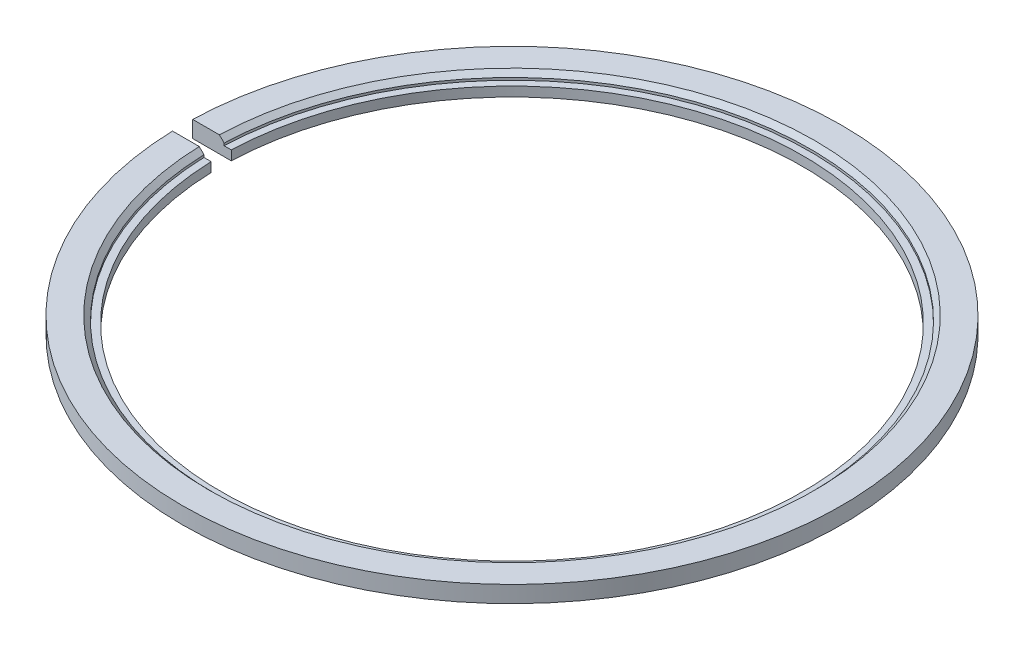
ISO-10303-21;
HEADER;
FILE_DESCRIPTION(('STEP AP214'),'2;1');
FILE_NAME('part.step','',(''),(''),'','','');
FILE_SCHEMA(('AUTOMOTIVE_DESIGN { 1 0 10303 214 1 1 1 1 }'));
ENDSEC;
DATA;
#1=APPLICATION_CONTEXT('core data for automotive mechanical design processes');
#2=APPLICATION_PROTOCOL_DEFINITION('international standard','automotive_design',2000,#1);
#3=PRODUCT_CONTEXT('',#1,'mechanical');
#4=PRODUCT('Part','Part','',(#3));
#5=PRODUCT_RELATED_PRODUCT_CATEGORY('part','',(#4));
#6=PRODUCT_DEFINITION_FORMATION('','',#4);
#7=PRODUCT_DEFINITION_CONTEXT('part definition',#1,'design');
#8=PRODUCT_DEFINITION('design','',#6,#7);
#9=PRODUCT_DEFINITION_SHAPE('','',#8);
#10=(LENGTH_UNIT() NAMED_UNIT(*) SI_UNIT(.MILLI.,.METRE.));
#11=(NAMED_UNIT(*) PLANE_ANGLE_UNIT() SI_UNIT($,.RADIAN.));
#12=(NAMED_UNIT(*) SI_UNIT($,.STERADIAN.) SOLID_ANGLE_UNIT());
#13=UNCERTAINTY_MEASURE_WITH_UNIT(LENGTH_MEASURE(1.E-05),#10,'distance_accuracy_value','');
#14=(GEOMETRIC_REPRESENTATION_CONTEXT(3) GLOBAL_UNCERTAINTY_ASSIGNED_CONTEXT((#13)) GLOBAL_UNIT_ASSIGNED_CONTEXT((#10,
#11,#12)) REPRESENTATION_CONTEXT('',''));
#15=CARTESIAN_POINT('',(0.,0.,0.));
#16=DIRECTION('',(0.,0.,1.));
#17=DIRECTION('',(1.,0.,0.));
#18=AXIS2_PLACEMENT_3D('',#15,#16,#17);
#19=CARTESIAN_POINT('',(-31.115,0.,0.));
#20=DIRECTION('',(0.,-1.,0.));
#21=DIRECTION('',(1.,0.,0.));
#22=AXIS2_PLACEMENT_3D('',#19,#20,#21);
#23=CYLINDRICAL_SURFACE('',#22,31.115);
#24=DIRECTION('',(0.,-1.,0.));
#25=VECTOR('',#24,1.);
#26=CARTESIAN_POINT('',(-62.2112683412335,0.,1.0795));
#27=LINE('',#26,#25);
#28=CARTESIAN_POINT('',(-62.2112683412335,1.01600000000004,1.0795));
#29=VERTEX_POINT('',#28);
#30=CARTESIAN_POINT('',(-62.2112683412335,0.,1.0795));
#31=VERTEX_POINT('',#30);
#32=EDGE_CURVE('E170',#29,#31,#27,.T.);
#33=ORIENTED_EDGE('',*,*,#32,.F.);
#34=CARTESIAN_POINT('',(-31.115,1.01600000000002,0.));
#35=DIRECTION('',(0.,-1.,0.));
#36=DIRECTION('',(1.,0.,0.));
#37=AXIS2_PLACEMENT_3D('',#34,#35,#36);
#38=CIRCLE('',#37,31.115);
#39=CARTESIAN_POINT('',(-62.2112683412335,1.01600000000004,-1.0795));
#40=VERTEX_POINT('',#39);
#41=EDGE_CURVE('E131',#40,#29,#38,.T.);
#42=ORIENTED_EDGE('',*,*,#41,.F.);
#43=DIRECTION('',(0.,-1.,0.));
#44=VECTOR('',#43,1.);
#45=CARTESIAN_POINT('',(-62.2112683412335,0.,-1.0795));
#46=LINE('',#45,#44);
#47=CARTESIAN_POINT('',(-62.2112683412335,0.,-1.0795));
#48=VERTEX_POINT('',#47);
#49=EDGE_CURVE('E107',#40,#48,#46,.T.);
#50=ORIENTED_EDGE('',*,*,#49,.T.);
#51=CARTESIAN_POINT('',(-31.115,0.,0.));
#52=DIRECTION('',(0.,-1.,0.));
#53=DIRECTION('',(1.,0.,0.));
#54=AXIS2_PLACEMENT_3D('',#51,#52,#53);
#55=CIRCLE('',#54,31.115);
#56=EDGE_CURVE('E116',#48,#31,#55,.T.);
#57=ORIENTED_EDGE('',*,*,#56,.T.);
#58=EDGE_LOOP('',(#33,#42,#50,#57));
#59=FACE_BOUND('',#58,.T.);
#60=ADVANCED_FACE('F35',(#59),#23,.F.);
#61=CARTESIAN_POINT('',(0.,1.016,0.));
#62=DIRECTION('',(0.,1.,0.));
#63=DIRECTION('',(-1.,0.,0.));
#64=AXIS2_PLACEMENT_3D('',#61,#62,#63);
#65=PLANE('',#64);
#66=DIRECTION('',(1.,0.,0.));
#67=VECTOR('',#66,1.);
#68=CARTESIAN_POINT('',(0.,1.016,1.0795));
#69=LINE('',#68,#67);
#70=CARTESIAN_POINT('',(-62.9737163700925,1.016,1.0795));
#71=VERTEX_POINT('',#70);
#72=EDGE_CURVE('E171',#71,#29,#69,.T.);
#73=ORIENTED_EDGE('',*,*,#72,.F.);
#74=CARTESIAN_POINT('',(-31.115,1.01600000000002,0.));
#75=DIRECTION('',(0.,-1.,0.));
#76=DIRECTION('',(1.,0.,0.));
#77=AXIS2_PLACEMENT_3D('',#74,#75,#76);
#78=CIRCLE('',#77,31.877);
#79=CARTESIAN_POINT('',(-62.9737163700925,1.016,-1.0795));
#80=VERTEX_POINT('',#79);
#81=EDGE_CURVE('E124',#80,#71,#78,.T.);
#82=ORIENTED_EDGE('',*,*,#81,.F.);
#83=DIRECTION('',(1.,0.,0.));
#84=VECTOR('',#83,1.);
#85=CARTESIAN_POINT('',(0.,1.016,-1.0795));
#86=LINE('',#85,#84);
#87=EDGE_CURVE('E176',#80,#40,#86,.T.);
#88=ORIENTED_EDGE('',*,*,#87,.T.);
#89=ORIENTED_EDGE('',*,*,#41,.T.);
#90=EDGE_LOOP('',(#73,#82,#88,#89));
#91=FACE_BOUND('',#90,.T.);
#92=ADVANCED_FACE('F160',(#91),#65,.T.);
#93=CARTESIAN_POINT('',(-31.115,0.,0.));
#94=DIRECTION('',(0.,-1.,0.));
#95=DIRECTION('',(1.,0.,0.));
#96=AXIS2_PLACEMENT_3D('',#93,#94,#95);
#97=CYLINDRICAL_SURFACE('',#96,31.877);
#98=DIRECTION('',(0.,-1.,0.));
#99=VECTOR('',#98,1.);
#100=CARTESIAN_POINT('',(-62.9737163700925,0.,1.0795));
#101=LINE('',#100,#99);
#102=CARTESIAN_POINT('',(-62.9737163700925,1.27000000000004,1.0795));
#103=VERTEX_POINT('',#102);
#104=EDGE_CURVE('E183',#103,#71,#101,.T.);
#105=ORIENTED_EDGE('',*,*,#104,.F.);
#106=CARTESIAN_POINT('',(-31.115,1.27000000000004,0.));
#107=DIRECTION('',(0.,1.,0.));
#108=DIRECTION('',(0.,0.,1.));
#109=AXIS2_PLACEMENT_3D('',#106,#107,#108);
#110=CIRCLE('',#109,31.877);
#111=CARTESIAN_POINT('',(-62.9737163700925,1.27000000000004,-1.0795));
#112=VERTEX_POINT('',#111);
#113=EDGE_CURVE('E137',#103,#112,#110,.T.);
#114=ORIENTED_EDGE('',*,*,#113,.T.);
#115=DIRECTION('',(0.,-1.,0.));
#116=VECTOR('',#115,1.);
#117=CARTESIAN_POINT('',(-62.9737163700925,0.,-1.0795));
#118=LINE('',#117,#116);
#119=EDGE_CURVE('E62',#112,#80,#118,.T.);
#120=ORIENTED_EDGE('',*,*,#119,.T.);
#121=ORIENTED_EDGE('',*,*,#81,.T.);
#122=EDGE_LOOP('',(#105,#114,#120,#121));
#123=FACE_BOUND('',#122,.T.);
#124=ADVANCED_FACE('F156',(#123),#97,.F.);
#125=CARTESIAN_POINT('',(0.762,1.778,0.));
#126=DIRECTION('',(0.,1.,0.));
#127=DIRECTION('',(-1.,0.,0.));
#128=AXIS2_PLACEMENT_3D('',#125,#126,#127);
#129=PLANE('',#128);
#130=DIRECTION('',(1.,0.,0.));
#131=VECTOR('',#130,1.);
#132=CARTESIAN_POINT('',(0.762,1.778,1.0795));
#133=LINE('',#132,#131);
#134=CARTESIAN_POINT('',(-66.3409632373623,1.77800000000005,1.0795));
#135=VERTEX_POINT('',#134);
#136=CARTESIAN_POINT('',(-63.4820033328697,1.77800000000004,1.0795));
#137=VERTEX_POINT('',#136);
#138=EDGE_CURVE('E54',#135,#137,#133,.T.);
#139=ORIENTED_EDGE('',*,*,#138,.F.);
#140=CARTESIAN_POINT('',(-31.115,1.77800000000002,0.));
#141=DIRECTION('',(0.,-1.,0.));
#142=DIRECTION('',(1.,0.,0.));
#143=AXIS2_PLACEMENT_3D('',#140,#141,#142);
#144=CIRCLE('',#143,35.2425);
#145=CARTESIAN_POINT('',(-66.3409632373623,1.77800000000005,-1.0795));
#146=VERTEX_POINT('',#145);
#147=EDGE_CURVE('E122',#146,#135,#144,.T.);
#148=ORIENTED_EDGE('',*,*,#147,.F.);
#149=DIRECTION('',(1.,0.,0.));
#150=VECTOR('',#149,1.);
#151=CARTESIAN_POINT('',(0.762,1.778,-1.0795));
#152=LINE('',#151,#150);
#153=CARTESIAN_POINT('',(-63.4820033328697,1.77800000000003,-1.0795));
#154=VERTEX_POINT('',#153);
#155=EDGE_CURVE('E102',#146,#154,#152,.T.);
#156=ORIENTED_EDGE('',*,*,#155,.T.);
#157=CARTESIAN_POINT('',(-31.115,1.77800000000002,0.));
#158=DIRECTION('',(0.,1.,0.));
#159=DIRECTION('',(-1.,0.,0.));
#160=AXIS2_PLACEMENT_3D('',#157,#158,#159);
#161=CIRCLE('',#160,32.385);
#162=EDGE_CURVE('E134',#154,#137,#161,.F.);
#163=ORIENTED_EDGE('',*,*,#162,.T.);
#164=EDGE_LOOP('',(#139,#148,#156,#163));
#165=FACE_BOUND('',#164,.T.);
#166=ADVANCED_FACE('F153',(#165),#129,.T.);
#167=CARTESIAN_POINT('',(-31.115,0.,0.));
#168=DIRECTION('',(0.,-1.,0.));
#169=DIRECTION('',(1.,0.,0.));
#170=AXIS2_PLACEMENT_3D('',#167,#168,#169);
#171=CYLINDRICAL_SURFACE('',#170,35.2425);
#172=DIRECTION('',(0.,-1.,0.));
#173=VECTOR('',#172,1.);
#174=CARTESIAN_POINT('',(-66.3409632373623,0.,1.0795));
#175=LINE('',#174,#173);
#176=CARTESIAN_POINT('',(-66.3409632373623,0.,1.0795));
#177=VERTEX_POINT('',#176);
#178=EDGE_CURVE('E121',#177,#135,#175,.F.);
#179=ORIENTED_EDGE('',*,*,#178,.F.);
#180=CARTESIAN_POINT('',(-31.115,0.,0.));
#181=DIRECTION('',(0.,-1.,0.));
#182=DIRECTION('',(1.,0.,0.));
#183=AXIS2_PLACEMENT_3D('',#180,#181,#182);
#184=CIRCLE('',#183,35.2425);
#185=CARTESIAN_POINT('',(-66.3409632373623,0.,-1.0795));
#186=VERTEX_POINT('',#185);
#187=EDGE_CURVE('E114',#186,#177,#184,.T.);
#188=ORIENTED_EDGE('',*,*,#187,.F.);
#189=DIRECTION('',(0.,-1.,0.));
#190=VECTOR('',#189,1.);
#191=CARTESIAN_POINT('',(-66.3409632373623,0.,-1.0795));
#192=LINE('',#191,#190);
#193=EDGE_CURVE('E96',#186,#146,#192,.F.);
#194=ORIENTED_EDGE('',*,*,#193,.T.);
#195=ORIENTED_EDGE('',*,*,#147,.T.);
#196=EDGE_LOOP('',(#179,#188,#194,#195));
#197=FACE_BOUND('',#196,.T.);
#198=ADVANCED_FACE('F120',(#197),#171,.T.);
#199=CARTESIAN_POINT('',(4.1275,0.,0.));
#200=DIRECTION('',(0.,-1.,0.));
#201=DIRECTION('',(1.,0.,0.));
#202=AXIS2_PLACEMENT_3D('',#199,#200,#201);
#203=PLANE('',#202);
#204=DIRECTION('',(1.,0.,0.));
#205=VECTOR('',#204,1.);
#206=CARTESIAN_POINT('',(-74.9711197799172,0.,1.0795));
#207=LINE('',#206,#205);
#208=EDGE_CURVE('E117',#177,#31,#207,.T.);
#209=ORIENTED_EDGE('',*,*,#208,.T.);
#210=ORIENTED_EDGE('',*,*,#56,.F.);
#211=DIRECTION('',(1.,0.,0.));
#212=VECTOR('',#211,1.);
#213=CARTESIAN_POINT('',(-74.9711197799172,0.,-1.0795));
#214=LINE('',#213,#212);
#215=EDGE_CURVE('E99',#186,#48,#214,.T.);
#216=ORIENTED_EDGE('',*,*,#215,.F.);
#217=ORIENTED_EDGE('',*,*,#187,.T.);
#218=EDGE_LOOP('',(#209,#210,#216,#217));
#219=FACE_BOUND('',#218,.T.);
#220=ADVANCED_FACE('F113',(#219),#203,.T.);
#221=CARTESIAN_POINT('',(-31.115,1.77800000000002,0.));
#222=DIRECTION('',(0.,1.,0.));
#223=DIRECTION('',(0.,0.,1.));
#224=AXIS2_PLACEMENT_3D('',#221,#222,#223);
#225=CONICAL_SURFACE('',#224,32.385,0.785398163397455);
#226=CARTESIAN_POINT('',(-80.3168874065797,18.6067282129664,1.0795));
#227=CARTESIAN_POINT('',(-77.3459083016034,15.6364874202653,1.0795));
#228=CARTESIAN_POINT('',(-74.374889387272,12.6662864323045,1.0795));
#229=CARTESIAN_POINT('',(-69.9181777463275,8.21116848982575,1.0795));
#230=CARTESIAN_POINT('',(-68.4325767045823,6.72615981569451,1.0795));
#231=CARTESIAN_POINT('',(-65.461292873975,3.75622422124599,1.0795));
#232=CARTESIAN_POINT('',(-63.9756100851122,2.27129730092951,1.0795));
#233=CARTESIAN_POINT('',(-61.0041220516502,-0.698434310050351,1.0795));
#234=CARTESIAN_POINT('',(-59.5183168070389,-2.18323900070159,1.0795));
#235=CARTESIAN_POINT('',(-56.5465136566234,-5.15265550132032,1.0795));
#236=CARTESIAN_POINT('',(-55.0605157508236,-6.63726731129221,1.0795));
#237=CARTESIAN_POINT('',(-52.0881951058565,-9.60616602549876,1.0795));
#238=CARTESIAN_POINT('',(-50.6018723666608,-11.090452929705,1.0795));
#239=CARTESIAN_POINT('',(-48.3719161066043,-13.316410447344,1.0795));
#240=CARTESIAN_POINT('',(-47.628518632575,-14.0583175088357,1.0795));
#241=CARTESIAN_POINT('',(-46.1414740159605,-15.541881434194,1.0795));
#242=CARTESIAN_POINT('',(-45.3978268733639,-16.2835382980492,1.0795));
#243=CARTESIAN_POINT('',(-44.6540087780256,-17.0250237468378,1.0795));
#244=B_SPLINE_CURVE_WITH_KNOTS('',3,(#226,#227,#228,#229,#230,#231,#232,#233,#234,#235,#236,
#237,#238,#239,#240,#241,#242,#243),.UNSPECIFIED.,.F.,.F.,(4,2,2,2,2,2,2,2,4),(0.,
12.6032307443012,18.9048456910761,25.206460699798,31.5080763332777,37.8096918226529,
44.1113078624117,47.2621161263436,50.4129245324004),.UNSPECIFIED.);
#245=EDGE_CURVE('E11',#137,#103,#244,.T.);
#246=ORIENTED_EDGE('',*,*,#245,.F.);
#247=ORIENTED_EDGE('',*,*,#162,.F.);
#248=CARTESIAN_POINT('',(-80.3168874065797,18.6067282129664,-1.0795));
#249=CARTESIAN_POINT('',(-77.3459083016034,15.6364874202653,-1.0795));
#250=CARTESIAN_POINT('',(-74.374889387272,12.6662864323045,-1.0795));
#251=CARTESIAN_POINT('',(-69.9181777463275,8.21116848982575,-1.0795));
#252=CARTESIAN_POINT('',(-68.4325767045823,6.72615981569451,-1.0795));
#253=CARTESIAN_POINT('',(-65.461292873975,3.75622422124599,-1.0795));
#254=CARTESIAN_POINT('',(-63.9756100851122,2.27129730092951,-1.0795));
#255=CARTESIAN_POINT('',(-61.0041220516502,-0.698434310050351,-1.0795));
#256=CARTESIAN_POINT('',(-59.5183168070389,-2.18323900070159,-1.0795));
#257=CARTESIAN_POINT('',(-56.5465136566234,-5.15265550132032,-1.0795));
#258=CARTESIAN_POINT('',(-55.0605157508236,-6.63726731129221,-1.0795));
#259=CARTESIAN_POINT('',(-52.0881951058565,-9.60616602549876,-1.0795));
#260=CARTESIAN_POINT('',(-50.6018723666608,-11.090452929705,-1.0795));
#261=CARTESIAN_POINT('',(-48.3719161066043,-13.316410447344,-1.0795));
#262=CARTESIAN_POINT('',(-47.628518632575,-14.0583175088357,-1.0795));
#263=CARTESIAN_POINT('',(-46.1414740159605,-15.541881434194,-1.0795));
#264=CARTESIAN_POINT('',(-45.3978268733639,-16.2835382980492,-1.0795));
#265=CARTESIAN_POINT('',(-44.6540087780256,-17.0250237468378,-1.0795));
#266=B_SPLINE_CURVE_WITH_KNOTS('',3,(#248,#249,#250,#251,#252,#253,#254,#255,#256,#257,#258,
#259,#260,#261,#262,#263,#264,#265),.UNSPECIFIED.,.F.,.F.,(4,2,2,2,2,2,2,2,4),(0.,
12.6032307443012,18.9048456910761,25.206460699798,31.5080763332777,37.8096918226529,
44.1113078624117,47.2621161263436,50.4129245324004),.UNSPECIFIED.);
#267=EDGE_CURVE('E48',#154,#112,#266,.T.);
#268=ORIENTED_EDGE('',*,*,#267,.T.);
#269=ORIENTED_EDGE('',*,*,#113,.F.);
#270=EDGE_LOOP('',(#246,#247,#268,#269));
#271=FACE_BOUND('',#270,.T.);
#272=ADVANCED_FACE('F37',(#271),#225,.F.);
#273=CARTESIAN_POINT('',(0.,0.,-1.0795));
#274=DIRECTION('',(0.,0.,1.));
#275=DIRECTION('',(1.,0.,0.));
#276=AXIS2_PLACEMENT_3D('',#273,#274,#275);
#277=PLANE('',#276);
#278=ORIENTED_EDGE('',*,*,#215,.T.);
#279=ORIENTED_EDGE('',*,*,#49,.F.);
#280=ORIENTED_EDGE('',*,*,#87,.F.);
#281=ORIENTED_EDGE('',*,*,#119,.F.);
#282=ORIENTED_EDGE('',*,*,#267,.F.);
#283=ORIENTED_EDGE('',*,*,#155,.F.);
#284=ORIENTED_EDGE('',*,*,#193,.F.);
#285=EDGE_LOOP('',(#278,#279,#280,#281,#282,#283,#284));
#286=FACE_BOUND('',#285,.T.);
#287=ADVANCED_FACE('F98',(#286),#277,.T.);
#288=CARTESIAN_POINT('',(0.,0.,1.0795));
#289=DIRECTION('',(0.,0.,1.));
#290=DIRECTION('',(1.,0.,0.));
#291=AXIS2_PLACEMENT_3D('',#288,#289,#290);
#292=PLANE('',#291);
#293=ORIENTED_EDGE('',*,*,#178,.T.);
#294=ORIENTED_EDGE('',*,*,#138,.T.);
#295=ORIENTED_EDGE('',*,*,#245,.T.);
#296=ORIENTED_EDGE('',*,*,#104,.T.);
#297=ORIENTED_EDGE('',*,*,#72,.T.);
#298=ORIENTED_EDGE('',*,*,#32,.T.);
#299=ORIENTED_EDGE('',*,*,#208,.F.);
#300=EDGE_LOOP('',(#293,#294,#295,#296,#297,#298,#299));
#301=FACE_BOUND('',#300,.T.);
#302=ADVANCED_FACE('F145',(#301),#292,.F.);
#303=CLOSED_SHELL('',(#60,#92,#124,#166,#198,#220,#272,#287,#302));
#304=MANIFOLD_SOLID_BREP('B2',#303);
#305=ADVANCED_BREP_SHAPE_REPRESENTATION('',(#18,#304),#14);
#306=SHAPE_DEFINITION_REPRESENTATION(#9,#305);
ENDSEC;
END-ISO-10303-21;
